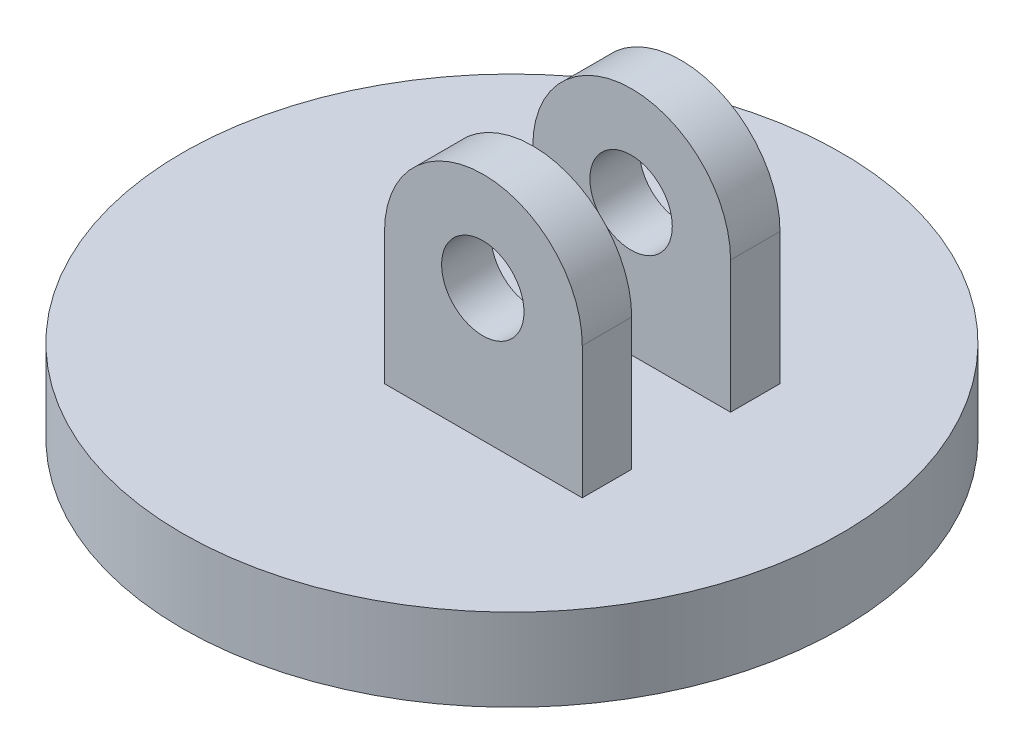
ISO-10303-21;
HEADER;
FILE_DESCRIPTION(('STEP AP214'),'2;1');
FILE_NAME('part.step','',(''),(''),'','','');
FILE_SCHEMA(('AUTOMOTIVE_DESIGN { 1 0 10303 214 1 1 1 1 }'));
ENDSEC;
DATA;
#1=APPLICATION_CONTEXT('core data for automotive mechanical design processes');
#2=APPLICATION_PROTOCOL_DEFINITION('international standard','automotive_design',2000,#1);
#3=PRODUCT_CONTEXT('',#1,'mechanical');
#4=PRODUCT('Part','Part','',(#3));
#5=PRODUCT_RELATED_PRODUCT_CATEGORY('part','',(#4));
#6=PRODUCT_DEFINITION_FORMATION('','',#4);
#7=PRODUCT_DEFINITION_CONTEXT('part definition',#1,'design');
#8=PRODUCT_DEFINITION('design','',#6,#7);
#9=PRODUCT_DEFINITION_SHAPE('','',#8);
#10=(LENGTH_UNIT() NAMED_UNIT(*) SI_UNIT(.MILLI.,.METRE.));
#11=(NAMED_UNIT(*) PLANE_ANGLE_UNIT() SI_UNIT($,.RADIAN.));
#12=(NAMED_UNIT(*) SI_UNIT($,.STERADIAN.) SOLID_ANGLE_UNIT());
#13=UNCERTAINTY_MEASURE_WITH_UNIT(LENGTH_MEASURE(1.E-05),#10,'distance_accuracy_value','');
#14=(GEOMETRIC_REPRESENTATION_CONTEXT(3) GLOBAL_UNCERTAINTY_ASSIGNED_CONTEXT((#13)) GLOBAL_UNIT_ASSIGNED_CONTEXT((#10,
#11,#12)) REPRESENTATION_CONTEXT('',''));
#15=CARTESIAN_POINT('',(0.,0.,0.));
#16=DIRECTION('',(0.,0.,1.));
#17=DIRECTION('',(1.,0.,0.));
#18=AXIS2_PLACEMENT_3D('',#15,#16,#17);
#19=CARTESIAN_POINT('',(0.,500.,0.));
#20=DIRECTION('',(0.,1.,0.));
#21=DIRECTION('',(0.,0.,1.));
#22=AXIS2_PLACEMENT_3D('',#19,#20,#21);
#23=PLANE('',#22);
#24=CARTESIAN_POINT('',(0.,500.,0.));
#25=DIRECTION('',(0.,1.,0.));
#26=DIRECTION('',(0.,0.,1.));
#27=AXIS2_PLACEMENT_3D('',#24,#25,#26);
#28=CIRCLE('',#27,2000.);
#29=CARTESIAN_POINT('',(0.,500.,2000.));
#30=VERTEX_POINT('',#29);
#31=EDGE_CURVE('E11',#30,#30,#28,.T.);
#32=ORIENTED_EDGE('',*,*,#31,.T.);
#33=EDGE_LOOP('',(#32));
#34=FACE_BOUND('',#33,.T.);
#35=DIRECTION('',(1.,0.,0.));
#36=VECTOR('',#35,1.);
#37=CARTESIAN_POINT('',(-173.205114408977,500.,-300.));
#38=LINE('',#37,#36);
#39=CARTESIAN_POINT('',(-173.205114408977,500.,-300.));
#40=VERTEX_POINT('',#39);
#41=CARTESIAN_POINT('',(1026.79488559102,500.,-300.));
#42=VERTEX_POINT('',#41);
#43=EDGE_CURVE('E161',#40,#42,#38,.T.);
#44=ORIENTED_EDGE('',*,*,#43,.F.);
#45=DIRECTION('',(0.,0.,1.));
#46=VECTOR('',#45,1.);
#47=CARTESIAN_POINT('',(-173.205114408977,500.,-600.));
#48=LINE('',#47,#46);
#49=CARTESIAN_POINT('',(-173.205114408977,500.,-600.));
#50=VERTEX_POINT('',#49);
#51=EDGE_CURVE('E148',#50,#40,#48,.T.);
#52=ORIENTED_EDGE('',*,*,#51,.F.);
#53=DIRECTION('',(-1.,0.,0.));
#54=VECTOR('',#53,1.);
#55=CARTESIAN_POINT('',(-173.205114408977,500.,-600.));
#56=LINE('',#55,#54);
#57=CARTESIAN_POINT('',(1026.79488559102,500.,-600.));
#58=VERTEX_POINT('',#57);
#59=EDGE_CURVE('E155',#58,#50,#56,.T.);
#60=ORIENTED_EDGE('',*,*,#59,.F.);
#61=DIRECTION('',(0.,0.,-1.));
#62=VECTOR('',#61,1.);
#63=CARTESIAN_POINT('',(1026.79488559102,500.,-600.));
#64=LINE('',#63,#62);
#65=EDGE_CURVE('E163',#42,#58,#64,.T.);
#66=ORIENTED_EDGE('',*,*,#65,.F.);
#67=EDGE_LOOP('',(#44,#52,#60,#66));
#68=FACE_BOUND('',#67,.T.);
#69=DIRECTION('',(1.,0.,0.));
#70=VECTOR('',#69,1.);
#71=CARTESIAN_POINT('',(-173.205114408977,500.,600.));
#72=LINE('',#71,#70);
#73=CARTESIAN_POINT('',(-173.205114408977,500.,600.));
#74=VERTEX_POINT('',#73);
#75=CARTESIAN_POINT('',(1026.79488559102,500.,600.));
#76=VERTEX_POINT('',#75);
#77=EDGE_CURVE('E117',#74,#76,#72,.T.);
#78=ORIENTED_EDGE('',*,*,#77,.F.);
#79=DIRECTION('',(0.,0.,1.));
#80=VECTOR('',#79,1.);
#81=CARTESIAN_POINT('',(-173.205114408977,500.,300.));
#82=LINE('',#81,#80);
#83=CARTESIAN_POINT('',(-173.205114408977,500.,300.));
#84=VERTEX_POINT('',#83);
#85=EDGE_CURVE('E126',#84,#74,#82,.T.);
#86=ORIENTED_EDGE('',*,*,#85,.F.);
#87=DIRECTION('',(-1.,0.,0.));
#88=VECTOR('',#87,1.);
#89=CARTESIAN_POINT('',(-173.205114408977,500.,300.));
#90=LINE('',#89,#88);
#91=CARTESIAN_POINT('',(1026.79488559102,500.,300.));
#92=VERTEX_POINT('',#91);
#93=EDGE_CURVE('E132',#92,#84,#90,.T.);
#94=ORIENTED_EDGE('',*,*,#93,.F.);
#95=DIRECTION('',(0.,0.,-1.));
#96=VECTOR('',#95,1.);
#97=CARTESIAN_POINT('',(1026.79488559102,500.,300.));
#98=LINE('',#97,#96);
#99=EDGE_CURVE('E137',#76,#92,#98,.T.);
#100=ORIENTED_EDGE('',*,*,#99,.F.);
#101=EDGE_LOOP('',(#78,#86,#94,#100));
#102=FACE_BOUND('',#101,.T.);
#103=ADVANCED_FACE('F34',(#34,#68,#102),#23,.T.);
#104=CARTESIAN_POINT('',(0.,500.,0.));
#105=DIRECTION('',(0.,-1.,0.));
#106=DIRECTION('',(0.,0.,-1.));
#107=AXIS2_PLACEMENT_3D('',#104,#105,#106);
#108=CYLINDRICAL_SURFACE('',#107,2000.);
#109=ORIENTED_EDGE('',*,*,#31,.F.);
#110=EDGE_LOOP('',(#109));
#111=FACE_BOUND('',#110,.T.);
#112=CARTESIAN_POINT('',(0.,0.,0.));
#113=DIRECTION('',(0.,1.,0.));
#114=DIRECTION('',(0.,0.,1.));
#115=AXIS2_PLACEMENT_3D('',#112,#113,#114);
#116=CIRCLE('',#115,2000.);
#117=CARTESIAN_POINT('',(0.,0.,2000.));
#118=VERTEX_POINT('',#117);
#119=EDGE_CURVE('E43',#118,#118,#116,.T.);
#120=ORIENTED_EDGE('',*,*,#119,.T.);
#121=EDGE_LOOP('',(#120));
#122=FACE_BOUND('',#121,.T.);
#123=ADVANCED_FACE('F36',(#111,#122),#108,.T.);
#124=CARTESIAN_POINT('',(0.,0.,0.));
#125=DIRECTION('',(0.,1.,0.));
#126=DIRECTION('',(0.,0.,1.));
#127=AXIS2_PLACEMENT_3D('',#124,#125,#126);
#128=PLANE('',#127);
#129=ORIENTED_EDGE('',*,*,#119,.F.);
#130=EDGE_LOOP('',(#129));
#131=FACE_BOUND('',#130,.T.);
#132=ADVANCED_FACE('F177',(#131),#128,.F.);
#133=CARTESIAN_POINT('',(-173.205114408977,1300.,-600.));
#134=DIRECTION('',(1.,0.,0.));
#135=DIRECTION('',(0.,0.,-1.));
#136=AXIS2_PLACEMENT_3D('',#133,#134,#135);
#137=PLANE('',#136);
#138=ORIENTED_EDGE('',*,*,#51,.T.);
#139=DIRECTION('',(0.,-1.,0.));
#140=VECTOR('',#139,1.);
#141=CARTESIAN_POINT('',(-173.205114408977,1300.,-300.));
#142=LINE('',#141,#140);
#143=CARTESIAN_POINT('',(-173.205114408977,1300.,-300.));
#144=VERTEX_POINT('',#143);
#145=EDGE_CURVE('E172',#144,#40,#142,.T.);
#146=ORIENTED_EDGE('',*,*,#145,.F.);
#147=DIRECTION('',(0.,0.,1.));
#148=VECTOR('',#147,1.);
#149=CARTESIAN_POINT('',(-173.205114408977,1300.,-600.));
#150=LINE('',#149,#148);
#151=CARTESIAN_POINT('',(-173.205114408977,1300.,-600.));
#152=VERTEX_POINT('',#151);
#153=EDGE_CURVE('E151',#152,#144,#150,.T.);
#154=ORIENTED_EDGE('',*,*,#153,.F.);
#155=DIRECTION('',(0.,-1.,0.));
#156=VECTOR('',#155,1.);
#157=CARTESIAN_POINT('',(-173.205114408977,1300.,-600.));
#158=LINE('',#157,#156);
#159=EDGE_CURVE('E158',#152,#50,#158,.T.);
#160=ORIENTED_EDGE('',*,*,#159,.T.);
#161=EDGE_LOOP('',(#138,#146,#154,#160));
#162=FACE_BOUND('',#161,.T.);
#163=ADVANCED_FACE('F179',(#162),#137,.F.);
#164=CARTESIAN_POINT('',(-173.205114408977,1300.,-300.));
#165=DIRECTION('',(0.,0.,-1.));
#166=DIRECTION('',(-1.,0.,0.));
#167=AXIS2_PLACEMENT_3D('',#164,#165,#166);
#168=PLANE('',#167);
#169=CARTESIAN_POINT('',(423.163464060309,1300.01098945258,-300.));
#170=DIRECTION('',(0.,0.,-1.));
#171=DIRECTION('',(-1.,0.,0.));
#172=AXIS2_PLACEMENT_3D('',#169,#170,#171);
#173=CIRCLE('',#172,250.);
#174=CARTESIAN_POINT('',(173.163464060309,1300.01098945258,-300.));
#175=VERTEX_POINT('',#174);
#176=EDGE_CURVE('E124',#175,#175,#173,.T.);
#177=ORIENTED_EDGE('',*,*,#176,.T.);
#178=EDGE_LOOP('',(#177));
#179=FACE_BOUND('',#178,.T.);
#180=ORIENTED_EDGE('',*,*,#43,.T.);
#181=DIRECTION('',(0.,-1.,0.));
#182=VECTOR('',#181,1.);
#183=CARTESIAN_POINT('',(1026.79488559102,1300.,-300.));
#184=LINE('',#183,#182);
#185=CARTESIAN_POINT('',(1026.79488559102,1300.,-300.));
#186=VERTEX_POINT('',#185);
#187=EDGE_CURVE('E169',#186,#42,#184,.T.);
#188=ORIENTED_EDGE('',*,*,#187,.F.);
#189=CARTESIAN_POINT('',(426.794885591023,1300.,-300.));
#190=DIRECTION('',(0.,0.,1.));
#191=DIRECTION('',(-1.,0.,0.));
#192=AXIS2_PLACEMENT_3D('',#189,#190,#191);
#193=CIRCLE('',#192,600.);
#194=EDGE_CURVE('E144',#186,#144,#193,.T.);
#195=ORIENTED_EDGE('',*,*,#194,.T.);
#196=ORIENTED_EDGE('',*,*,#145,.T.);
#197=EDGE_LOOP('',(#180,#188,#195,#196));
#198=FACE_BOUND('',#197,.T.);
#199=ADVANCED_FACE('F184',(#179,#198),#168,.F.);
#200=CARTESIAN_POINT('',(1026.79488559102,1300.,-600.));
#201=DIRECTION('',(-1.,0.,0.));
#202=DIRECTION('',(0.,0.,1.));
#203=AXIS2_PLACEMENT_3D('',#200,#201,#202);
#204=PLANE('',#203);
#205=ORIENTED_EDGE('',*,*,#65,.T.);
#206=DIRECTION('',(0.,-1.,0.));
#207=VECTOR('',#206,1.);
#208=CARTESIAN_POINT('',(1026.79488559102,1300.,-600.));
#209=LINE('',#208,#207);
#210=CARTESIAN_POINT('',(1026.79488559102,1300.,-600.));
#211=VERTEX_POINT('',#210);
#212=EDGE_CURVE('E59',#211,#58,#209,.T.);
#213=ORIENTED_EDGE('',*,*,#212,.F.);
#214=DIRECTION('',(0.,0.,-1.));
#215=VECTOR('',#214,1.);
#216=CARTESIAN_POINT('',(1026.79488559102,1300.,-600.));
#217=LINE('',#216,#215);
#218=EDGE_CURVE('E154',#186,#211,#217,.T.);
#219=ORIENTED_EDGE('',*,*,#218,.F.);
#220=ORIENTED_EDGE('',*,*,#187,.T.);
#221=EDGE_LOOP('',(#205,#213,#219,#220));
#222=FACE_BOUND('',#221,.T.);
#223=ADVANCED_FACE('F197',(#222),#204,.F.);
#224=CARTESIAN_POINT('',(-173.205114408977,1300.,-600.));
#225=DIRECTION('',(0.,0.,1.));
#226=DIRECTION('',(1.,0.,0.));
#227=AXIS2_PLACEMENT_3D('',#224,#225,#226);
#228=PLANE('',#227);
#229=CARTESIAN_POINT('',(423.163464060309,1300.01098945258,-600.));
#230=DIRECTION('',(0.,0.,1.));
#231=DIRECTION('',(1.,0.,0.));
#232=AXIS2_PLACEMENT_3D('',#229,#230,#231);
#233=CIRCLE('',#232,250.);
#234=CARTESIAN_POINT('',(673.163464060309,1300.01098945258,-600.));
#235=VERTEX_POINT('',#234);
#236=EDGE_CURVE('E129',#235,#235,#233,.T.);
#237=ORIENTED_EDGE('',*,*,#236,.T.);
#238=EDGE_LOOP('',(#237));
#239=FACE_BOUND('',#238,.T.);
#240=ORIENTED_EDGE('',*,*,#59,.T.);
#241=ORIENTED_EDGE('',*,*,#159,.F.);
#242=CARTESIAN_POINT('',(426.794885591023,1300.,-600.));
#243=DIRECTION('',(0.,0.,1.));
#244=DIRECTION('',(-1.,0.,0.));
#245=AXIS2_PLACEMENT_3D('',#242,#243,#244);
#246=CIRCLE('',#245,600.);
#247=EDGE_CURVE('E145',#211,#152,#246,.T.);
#248=ORIENTED_EDGE('',*,*,#247,.F.);
#249=ORIENTED_EDGE('',*,*,#212,.T.);
#250=EDGE_LOOP('',(#240,#241,#248,#249));
#251=FACE_BOUND('',#250,.T.);
#252=ADVANCED_FACE('F201',(#239,#251),#228,.F.);
#253=CARTESIAN_POINT('',(426.794885591023,1300.,-600.));
#254=DIRECTION('',(0.,0.,1.));
#255=DIRECTION('',(1.,0.,0.));
#256=AXIS2_PLACEMENT_3D('',#253,#254,#255);
#257=CYLINDRICAL_SURFACE('',#256,600.);
#258=ORIENTED_EDGE('',*,*,#194,.F.);
#259=ORIENTED_EDGE('',*,*,#218,.T.);
#260=ORIENTED_EDGE('',*,*,#247,.T.);
#261=ORIENTED_EDGE('',*,*,#153,.T.);
#262=EDGE_LOOP('',(#258,#259,#260,#261));
#263=FACE_BOUND('',#262,.T.);
#264=ADVANCED_FACE('F205',(#263),#257,.T.);
#265=CARTESIAN_POINT('',(-173.205114408977,1300.,300.));
#266=DIRECTION('',(1.,0.,0.));
#267=DIRECTION('',(0.,0.,-1.));
#268=AXIS2_PLACEMENT_3D('',#265,#266,#267);
#269=PLANE('',#268);
#270=ORIENTED_EDGE('',*,*,#85,.T.);
#271=DIRECTION('',(0.,-1.,0.));
#272=VECTOR('',#271,1.);
#273=CARTESIAN_POINT('',(-173.205114408977,1300.,600.));
#274=LINE('',#273,#272);
#275=CARTESIAN_POINT('',(-173.205114408977,1300.,600.));
#276=VERTEX_POINT('',#275);
#277=EDGE_CURVE('E118',#276,#74,#274,.T.);
#278=ORIENTED_EDGE('',*,*,#277,.F.);
#279=DIRECTION('',(0.,0.,1.));
#280=VECTOR('',#279,1.);
#281=CARTESIAN_POINT('',(-173.205114408977,1300.,300.));
#282=LINE('',#281,#280);
#283=CARTESIAN_POINT('',(-173.205114408977,1300.,300.));
#284=VERTEX_POINT('',#283);
#285=EDGE_CURVE('E110',#284,#276,#282,.T.);
#286=ORIENTED_EDGE('',*,*,#285,.F.);
#287=DIRECTION('',(0.,-1.,0.));
#288=VECTOR('',#287,1.);
#289=CARTESIAN_POINT('',(-173.205114408977,1300.,300.));
#290=LINE('',#289,#288);
#291=EDGE_CURVE('E109',#284,#84,#290,.T.);
#292=ORIENTED_EDGE('',*,*,#291,.T.);
#293=EDGE_LOOP('',(#270,#278,#286,#292));
#294=FACE_BOUND('',#293,.T.);
#295=ADVANCED_FACE('F209',(#294),#269,.F.);
#296=CARTESIAN_POINT('',(-173.205114408977,1300.,600.));
#297=DIRECTION('',(0.,0.,-1.));
#298=DIRECTION('',(-1.,0.,0.));
#299=AXIS2_PLACEMENT_3D('',#296,#297,#298);
#300=PLANE('',#299);
#301=CARTESIAN_POINT('',(423.163464060309,1300.01098945258,600.));
#302=DIRECTION('',(0.,0.,-1.));
#303=DIRECTION('',(-1.,0.,0.));
#304=AXIS2_PLACEMENT_3D('',#301,#302,#303);
#305=CIRCLE('',#304,250.);
#306=CARTESIAN_POINT('',(173.163464060309,1300.01098945258,600.));
#307=VERTEX_POINT('',#306);
#308=EDGE_CURVE('E248',#307,#307,#305,.T.);
#309=ORIENTED_EDGE('',*,*,#308,.T.);
#310=EDGE_LOOP('',(#309));
#311=FACE_BOUND('',#310,.T.);
#312=ORIENTED_EDGE('',*,*,#77,.T.);
#313=DIRECTION('',(0.,-1.,0.));
#314=VECTOR('',#313,1.);
#315=CARTESIAN_POINT('',(1026.79488559102,1300.,600.));
#316=LINE('',#315,#314);
#317=CARTESIAN_POINT('',(1026.79488559102,1300.,600.));
#318=VERTEX_POINT('',#317);
#319=EDGE_CURVE('E104',#318,#76,#316,.T.);
#320=ORIENTED_EDGE('',*,*,#319,.F.);
#321=CARTESIAN_POINT('',(426.794885591023,1300.,600.));
#322=DIRECTION('',(0.,0.,1.));
#323=DIRECTION('',(-1.,0.,0.));
#324=AXIS2_PLACEMENT_3D('',#321,#322,#323);
#325=CIRCLE('',#324,600.);
#326=EDGE_CURVE('E115',#318,#276,#325,.T.);
#327=ORIENTED_EDGE('',*,*,#326,.T.);
#328=ORIENTED_EDGE('',*,*,#277,.T.);
#329=EDGE_LOOP('',(#312,#320,#327,#328));
#330=FACE_BOUND('',#329,.T.);
#331=ADVANCED_FACE('F114',(#311,#330),#300,.F.);
#332=CARTESIAN_POINT('',(1026.79488559102,1300.,300.));
#333=DIRECTION('',(-1.,0.,0.));
#334=DIRECTION('',(0.,0.,1.));
#335=AXIS2_PLACEMENT_3D('',#332,#333,#334);
#336=PLANE('',#335);
#337=ORIENTED_EDGE('',*,*,#99,.T.);
#338=DIRECTION('',(0.,-1.,0.));
#339=VECTOR('',#338,1.);
#340=CARTESIAN_POINT('',(1026.79488559102,1300.,300.));
#341=LINE('',#340,#339);
#342=CARTESIAN_POINT('',(1026.79488559102,1300.,300.));
#343=VERTEX_POINT('',#342);
#344=EDGE_CURVE('E51',#343,#92,#341,.T.);
#345=ORIENTED_EDGE('',*,*,#344,.F.);
#346=DIRECTION('',(0.,0.,-1.));
#347=VECTOR('',#346,1.);
#348=CARTESIAN_POINT('',(1026.79488559102,1300.,300.));
#349=LINE('',#348,#347);
#350=EDGE_CURVE('E101',#318,#343,#349,.T.);
#351=ORIENTED_EDGE('',*,*,#350,.F.);
#352=ORIENTED_EDGE('',*,*,#319,.T.);
#353=EDGE_LOOP('',(#337,#345,#351,#352));
#354=FACE_BOUND('',#353,.T.);
#355=ADVANCED_FACE('F103',(#354),#336,.F.);
#356=CARTESIAN_POINT('',(-173.205114408977,1300.,300.));
#357=DIRECTION('',(0.,0.,1.));
#358=DIRECTION('',(1.,0.,0.));
#359=AXIS2_PLACEMENT_3D('',#356,#357,#358);
#360=PLANE('',#359);
#361=CARTESIAN_POINT('',(423.163464060309,1300.01098945258,300.));
#362=DIRECTION('',(0.,0.,1.));
#363=DIRECTION('',(1.,0.,0.));
#364=AXIS2_PLACEMENT_3D('',#361,#362,#363);
#365=CIRCLE('',#364,250.);
#366=CARTESIAN_POINT('',(673.163464060309,1300.01098945258,300.));
#367=VERTEX_POINT('',#366);
#368=EDGE_CURVE('E38',#367,#367,#365,.T.);
#369=ORIENTED_EDGE('',*,*,#368,.T.);
#370=EDGE_LOOP('',(#369));
#371=FACE_BOUND('',#370,.T.);
#372=ORIENTED_EDGE('',*,*,#93,.T.);
#373=ORIENTED_EDGE('',*,*,#291,.F.);
#374=CARTESIAN_POINT('',(426.794885591023,1300.,300.));
#375=DIRECTION('',(0.,0.,1.));
#376=DIRECTION('',(-1.,0.,0.));
#377=AXIS2_PLACEMENT_3D('',#374,#375,#376);
#378=CIRCLE('',#377,600.);
#379=EDGE_CURVE('E123',#343,#284,#378,.T.);
#380=ORIENTED_EDGE('',*,*,#379,.F.);
#381=ORIENTED_EDGE('',*,*,#344,.T.);
#382=EDGE_LOOP('',(#372,#373,#380,#381));
#383=FACE_BOUND('',#382,.T.);
#384=ADVANCED_FACE('F219',(#371,#383),#360,.F.);
#385=CARTESIAN_POINT('',(426.794885591023,1300.,300.));
#386=DIRECTION('',(0.,0.,1.));
#387=DIRECTION('',(1.,0.,0.));
#388=AXIS2_PLACEMENT_3D('',#385,#386,#387);
#389=CYLINDRICAL_SURFACE('',#388,600.);
#390=ORIENTED_EDGE('',*,*,#326,.F.);
#391=ORIENTED_EDGE('',*,*,#350,.T.);
#392=ORIENTED_EDGE('',*,*,#379,.T.);
#393=ORIENTED_EDGE('',*,*,#285,.T.);
#394=EDGE_LOOP('',(#390,#391,#392,#393));
#395=FACE_BOUND('',#394,.T.);
#396=ADVANCED_FACE('F121',(#395),#389,.T.);
#397=CARTESIAN_POINT('',(423.163464060309,1300.01098945258,-2000.));
#398=DIRECTION('',(0.,0.,1.));
#399=DIRECTION('',(1.,0.,0.));
#400=AXIS2_PLACEMENT_3D('',#397,#398,#399);
#401=CYLINDRICAL_SURFACE('',#400,250.);
#402=ORIENTED_EDGE('',*,*,#368,.F.);
#403=EDGE_LOOP('',(#402));
#404=FACE_BOUND('',#403,.T.);
#405=ORIENTED_EDGE('',*,*,#308,.F.);
#406=EDGE_LOOP('',(#405));
#407=FACE_BOUND('',#406,.T.);
#408=ADVANCED_FACE('F225',(#404,#407),#401,.F.);
#409=ORIENTED_EDGE('',*,*,#236,.F.);
#410=EDGE_LOOP('',(#409));
#411=FACE_BOUND('',#410,.T.);
#412=ORIENTED_EDGE('',*,*,#176,.F.);
#413=EDGE_LOOP('',(#412));
#414=FACE_BOUND('',#413,.T.);
#415=ADVANCED_FACE('F226',(#411,#414),#401,.F.);
#416=CLOSED_SHELL('',(#103,#123,#132,#163,#199,#223,#252,#264,#295,#331,#355,#384,#396,#408,#415));
#417=MANIFOLD_SOLID_BREP('B2',#416);
#418=ADVANCED_BREP_SHAPE_REPRESENTATION('',(#18,#417),#14);
#419=SHAPE_DEFINITION_REPRESENTATION(#9,#418);
ENDSEC;
END-ISO-10303-21;
